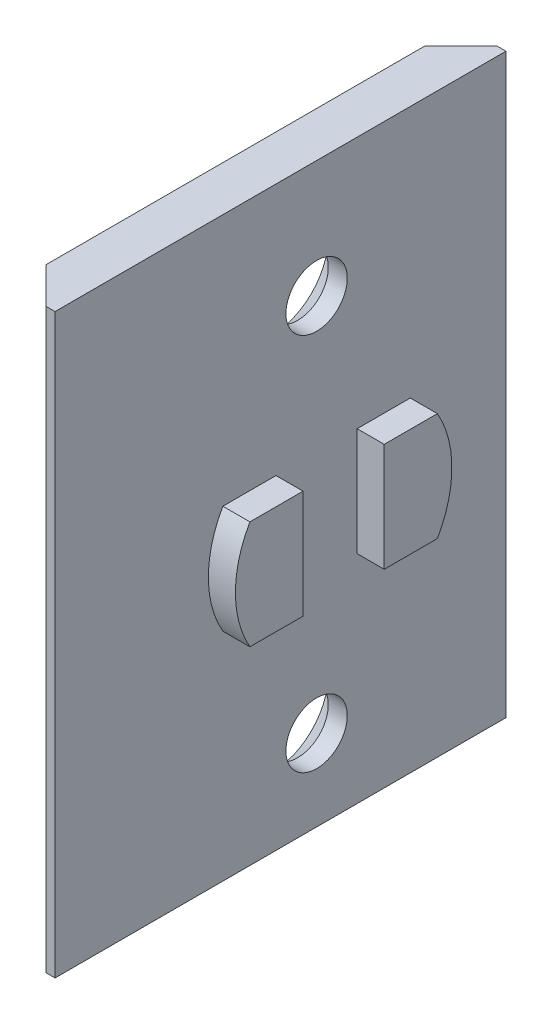
ISO-10303-21;
HEADER;
FILE_DESCRIPTION(('STEP AP214'),'2;1');
FILE_NAME('part.step','',(''),(''),'','','');
FILE_SCHEMA(('AUTOMOTIVE_DESIGN { 1 0 10303 214 1 1 1 1 }'));
ENDSEC;
DATA;
#1=APPLICATION_CONTEXT('core data for automotive mechanical design processes');
#2=APPLICATION_PROTOCOL_DEFINITION('international standard','automotive_design',2000,#1);
#3=PRODUCT_CONTEXT('',#1,'mechanical');
#4=PRODUCT('Part','Part','',(#3));
#5=PRODUCT_RELATED_PRODUCT_CATEGORY('part','',(#4));
#6=PRODUCT_DEFINITION_FORMATION('','',#4);
#7=PRODUCT_DEFINITION_CONTEXT('part definition',#1,'design');
#8=PRODUCT_DEFINITION('design','',#6,#7);
#9=PRODUCT_DEFINITION_SHAPE('','',#8);
#10=(LENGTH_UNIT() NAMED_UNIT(*) SI_UNIT(.MILLI.,.METRE.));
#11=(NAMED_UNIT(*) PLANE_ANGLE_UNIT() SI_UNIT($,.RADIAN.));
#12=(NAMED_UNIT(*) SI_UNIT($,.STERADIAN.) SOLID_ANGLE_UNIT());
#13=UNCERTAINTY_MEASURE_WITH_UNIT(LENGTH_MEASURE(1.E-05),#10,'distance_accuracy_value','');
#14=(GEOMETRIC_REPRESENTATION_CONTEXT(3) GLOBAL_UNCERTAINTY_ASSIGNED_CONTEXT((#13)) GLOBAL_UNIT_ASSIGNED_CONTEXT((#10,
#11,#12)) REPRESENTATION_CONTEXT('',''));
#15=CARTESIAN_POINT('',(0.,0.,0.));
#16=DIRECTION('',(0.,0.,1.));
#17=DIRECTION('',(1.,0.,0.));
#18=AXIS2_PLACEMENT_3D('',#15,#16,#17);
#19=CARTESIAN_POINT('',(4.,-1.00000000000006,-1.99999999999998));
#20=DIRECTION('',(-1.,0.,0.));
#21=DIRECTION('',(0.,0.,1.));
#22=AXIS2_PLACEMENT_3D('',#19,#20,#21);
#23=CYLINDRICAL_SURFACE('',#22,6.);
#24=DIRECTION('',(1.,0.,0.));
#25=VECTOR('',#24,1.);
#26=CARTESIAN_POINT('',(-8.316653826392,-4.00000000000005,3.19615242270664));
#27=LINE('',#26,#25);
#28=CARTESIAN_POINT('',(2.5,-4.00000000000007,3.19615242270668));
#29=VERTEX_POINT('',#28);
#30=CARTESIAN_POINT('',(3.99999999999999,-4.00000000000006,3.19615242270666));
#31=VERTEX_POINT('',#30);
#32=EDGE_CURVE('E149',#29,#31,#27,.T.);
#33=ORIENTED_EDGE('',*,*,#32,.T.);
#34=CARTESIAN_POINT('',(4.,-1.00000000000006,-1.99999999999998));
#35=DIRECTION('',(1.,0.,0.));
#36=DIRECTION('',(0.,0.,-1.));
#37=AXIS2_PLACEMENT_3D('',#34,#35,#36);
#38=CIRCLE('',#37,6.);
#39=CARTESIAN_POINT('',(4.,1.99999999999994,3.19615242270666));
#40=VERTEX_POINT('',#39);
#41=EDGE_CURVE('E224',#40,#31,#38,.T.);
#42=ORIENTED_EDGE('',*,*,#41,.F.);
#43=DIRECTION('',(1.,0.,0.));
#44=VECTOR('',#43,1.);
#45=CARTESIAN_POINT('',(-8.316653826392,1.99999999999995,3.19615242270664));
#46=LINE('',#45,#44);
#47=CARTESIAN_POINT('',(2.5,1.99999999999995,3.19615242270666));
#48=VERTEX_POINT('',#47);
#49=EDGE_CURVE('E243',#48,#40,#46,.T.);
#50=ORIENTED_EDGE('',*,*,#49,.F.);
#51=CARTESIAN_POINT('',(2.5,-1.00000000000006,-1.99999999999998));
#52=DIRECTION('',(-1.,0.,0.));
#53=DIRECTION('',(0.,0.,1.));
#54=AXIS2_PLACEMENT_3D('',#51,#52,#53);
#55=CIRCLE('',#54,6.);
#56=EDGE_CURVE('E156',#48,#29,#55,.F.);
#57=ORIENTED_EDGE('',*,*,#56,.T.);
#58=EDGE_LOOP('',(#33,#42,#50,#57));
#59=FACE_BOUND('',#58,.T.);
#60=ADVANCED_FACE('F36',(#59),#23,.T.);
#61=CARTESIAN_POINT('',(4.,0.,0.));
#62=DIRECTION('',(1.,0.,0.));
#63=DIRECTION('',(0.,0.,-1.));
#64=AXIS2_PLACEMENT_3D('',#61,#62,#63);
#65=PLANE('',#64);
#66=ORIENTED_EDGE('',*,*,#41,.T.);
#67=DIRECTION('',(0.,0.,-1.));
#68=VECTOR('',#67,1.);
#69=CARTESIAN_POINT('',(4.,-4.00000000000006,0.));
#70=LINE('',#69,#68);
#71=CARTESIAN_POINT('',(4.,-4.00000000000006,0.250000000000021));
#72=VERTEX_POINT('',#71);
#73=EDGE_CURVE('E253',#31,#72,#70,.T.);
#74=ORIENTED_EDGE('',*,*,#73,.T.);
#75=DIRECTION('',(0.,1.,0.));
#76=VECTOR('',#75,1.);
#77=CARTESIAN_POINT('',(4.,0.,0.250000000000021));
#78=LINE('',#77,#76);
#79=CARTESIAN_POINT('',(4.,1.99999999999994,0.250000000000021));
#80=VERTEX_POINT('',#79);
#81=EDGE_CURVE('E232',#72,#80,#78,.T.);
#82=ORIENTED_EDGE('',*,*,#81,.T.);
#83=DIRECTION('',(0.,0.,-1.));
#84=VECTOR('',#83,1.);
#85=CARTESIAN_POINT('',(4.,1.99999999999994,0.));
#86=LINE('',#85,#84);
#87=EDGE_CURVE('E245',#40,#80,#86,.T.);
#88=ORIENTED_EDGE('',*,*,#87,.F.);
#89=EDGE_LOOP('',(#66,#74,#82,#88));
#90=FACE_BOUND('',#89,.T.);
#91=ADVANCED_FACE('F260',(#90),#65,.T.);
#92=CARTESIAN_POINT('',(4.,0.,-4.24999999999999));
#93=DIRECTION('',(0.,0.,1.));
#94=DIRECTION('',(1.,0.,0.));
#95=AXIS2_PLACEMENT_3D('',#92,#93,#94);
#96=PLANE('',#95);
#97=DIRECTION('',(0.,1.,0.));
#98=VECTOR('',#97,1.);
#99=CARTESIAN_POINT('',(2.5,0.,-4.24999999999999));
#100=LINE('',#99,#98);
#101=CARTESIAN_POINT('',(2.5,-4.00000000000006,-4.24999999999999));
#102=VERTEX_POINT('',#101);
#103=CARTESIAN_POINT('',(2.5,1.99999999999995,-4.24999999999999));
#104=VERTEX_POINT('',#103);
#105=EDGE_CURVE('E228',#102,#104,#100,.T.);
#106=ORIENTED_EDGE('',*,*,#105,.F.);
#107=DIRECTION('',(1.,0.,0.));
#108=VECTOR('',#107,1.);
#109=CARTESIAN_POINT('',(4.,-4.00000000000006,-4.24999999999999));
#110=LINE('',#109,#108);
#111=CARTESIAN_POINT('',(4.,-4.00000000000006,-4.24999999999999));
#112=VERTEX_POINT('',#111);
#113=EDGE_CURVE('E137',#102,#112,#110,.T.);
#114=ORIENTED_EDGE('',*,*,#113,.T.);
#115=DIRECTION('',(0.,1.,0.));
#116=VECTOR('',#115,1.);
#117=CARTESIAN_POINT('',(4.,0.,-4.24999999999999));
#118=LINE('',#117,#116);
#119=CARTESIAN_POINT('',(4.,1.99999999999994,-4.24999999999999));
#120=VERTEX_POINT('',#119);
#121=EDGE_CURVE('E227',#112,#120,#118,.T.);
#122=ORIENTED_EDGE('',*,*,#121,.T.);
#123=DIRECTION('',(1.,0.,0.));
#124=VECTOR('',#123,1.);
#125=CARTESIAN_POINT('',(4.,1.99999999999994,-4.24999999999999));
#126=LINE('',#125,#124);
#127=EDGE_CURVE('E230',#104,#120,#126,.T.);
#128=ORIENTED_EDGE('',*,*,#127,.F.);
#129=EDGE_LOOP('',(#106,#114,#122,#128));
#130=FACE_BOUND('',#129,.T.);
#131=ADVANCED_FACE('F285',(#130),#96,.T.);
#132=CARTESIAN_POINT('',(4.,0.,0.250000000000021));
#133=DIRECTION('',(0.,0.,1.));
#134=DIRECTION('',(1.,0.,0.));
#135=AXIS2_PLACEMENT_3D('',#132,#133,#134);
#136=PLANE('',#135);
#137=DIRECTION('',(1.,0.,0.));
#138=VECTOR('',#137,1.);
#139=CARTESIAN_POINT('',(4.,-4.00000000000006,0.250000000000021));
#140=LINE('',#139,#138);
#141=CARTESIAN_POINT('',(2.5,-4.00000000000006,0.250000000000021));
#142=VERTEX_POINT('',#141);
#143=EDGE_CURVE('E251',#142,#72,#140,.T.);
#144=ORIENTED_EDGE('',*,*,#143,.F.);
#145=DIRECTION('',(0.,1.,0.));
#146=VECTOR('',#145,1.);
#147=CARTESIAN_POINT('',(2.5,0.,0.250000000000021));
#148=LINE('',#147,#146);
#149=CARTESIAN_POINT('',(2.5,1.99999999999995,0.250000000000021));
#150=VERTEX_POINT('',#149);
#151=EDGE_CURVE('E225',#142,#150,#148,.T.);
#152=ORIENTED_EDGE('',*,*,#151,.T.);
#153=DIRECTION('',(1.,0.,0.));
#154=VECTOR('',#153,1.);
#155=CARTESIAN_POINT('',(4.,1.99999999999994,0.250000000000021));
#156=LINE('',#155,#154);
#157=EDGE_CURVE('E237',#150,#80,#156,.T.);
#158=ORIENTED_EDGE('',*,*,#157,.T.);
#159=ORIENTED_EDGE('',*,*,#81,.F.);
#160=EDGE_LOOP('',(#144,#152,#158,#159));
#161=FACE_BOUND('',#160,.T.);
#162=ADVANCED_FACE('F264',(#161),#136,.F.);
#163=DIRECTION('',(1.,0.,0.));
#164=VECTOR('',#163,1.);
#165=CARTESIAN_POINT('',(-8.31665382639199,-4.00000000000005,-7.19615242270664));
#166=LINE('',#165,#164);
#167=CARTESIAN_POINT('',(2.5,-4.00000000000006,-7.19615242270662));
#168=VERTEX_POINT('',#167);
#169=CARTESIAN_POINT('',(4.,-4.00000000000006,-7.19615242270662));
#170=VERTEX_POINT('',#169);
#171=EDGE_CURVE('E59',#168,#170,#166,.T.);
#172=ORIENTED_EDGE('',*,*,#171,.F.);
#173=CARTESIAN_POINT('',(2.5,1.99999999999995,-7.19615242270665));
#174=VERTEX_POINT('',#173);
#175=EDGE_CURVE('E146',#168,#174,#55,.F.);
#176=ORIENTED_EDGE('',*,*,#175,.T.);
#177=DIRECTION('',(1.,0.,0.));
#178=VECTOR('',#177,1.);
#179=CARTESIAN_POINT('',(-8.31665382639198,1.99999999999995,-7.19615242270664));
#180=LINE('',#179,#178);
#181=CARTESIAN_POINT('',(4.00000000000001,1.99999999999994,-7.19615242270662));
#182=VERTEX_POINT('',#181);
#183=EDGE_CURVE('E240',#174,#182,#180,.T.);
#184=ORIENTED_EDGE('',*,*,#183,.T.);
#185=EDGE_CURVE('E148',#170,#182,#38,.T.);
#186=ORIENTED_EDGE('',*,*,#185,.F.);
#187=EDGE_LOOP('',(#172,#176,#184,#186));
#188=FACE_BOUND('',#187,.T.);
#189=ADVANCED_FACE('F144',(#188),#23,.T.);
#190=ORIENTED_EDGE('',*,*,#121,.F.);
#191=DIRECTION('',(0.,0.,-1.));
#192=VECTOR('',#191,1.);
#193=CARTESIAN_POINT('',(4.,-4.00000000000006,0.));
#194=LINE('',#193,#192);
#195=EDGE_CURVE('E11',#112,#170,#194,.T.);
#196=ORIENTED_EDGE('',*,*,#195,.T.);
#197=ORIENTED_EDGE('',*,*,#185,.T.);
#198=DIRECTION('',(0.,0.,-1.));
#199=VECTOR('',#198,1.);
#200=CARTESIAN_POINT('',(4.,1.99999999999994,0.));
#201=LINE('',#200,#199);
#202=EDGE_CURVE('E44',#120,#182,#201,.T.);
#203=ORIENTED_EDGE('',*,*,#202,.F.);
#204=EDGE_LOOP('',(#190,#196,#197,#203));
#205=FACE_BOUND('',#204,.T.);
#206=ADVANCED_FACE('F287',(#205),#65,.T.);
#207=CARTESIAN_POINT('',(2.5,-16.,-12.5));
#208=DIRECTION('',(0.,0.,1.));
#209=DIRECTION('',(1.,0.,0.));
#210=AXIS2_PLACEMENT_3D('',#207,#208,#209);
#211=PLANE('',#210);
#212=DIRECTION('',(-1.,0.,0.));
#213=VECTOR('',#212,1.);
#214=CARTESIAN_POINT('',(2.5,-16.,-12.5));
#215=LINE('',#214,#213);
#216=CARTESIAN_POINT('',(2.5,-16.,-12.5));
#217=VERTEX_POINT('',#216);
#218=CARTESIAN_POINT('',(2.,-16.,-12.5));
#219=VERTEX_POINT('',#218);
#220=EDGE_CURVE('E188',#217,#219,#215,.T.);
#221=ORIENTED_EDGE('',*,*,#220,.T.);
#222=DIRECTION('',(0.,1.,0.));
#223=VECTOR('',#222,1.);
#224=CARTESIAN_POINT('',(2.,16.,-12.5));
#225=LINE('',#224,#223);
#226=CARTESIAN_POINT('',(2.,16.,-12.5));
#227=VERTEX_POINT('',#226);
#228=EDGE_CURVE('E160',#219,#227,#225,.T.);
#229=ORIENTED_EDGE('',*,*,#228,.T.);
#230=DIRECTION('',(-1.,0.,0.));
#231=VECTOR('',#230,1.);
#232=CARTESIAN_POINT('',(2.5,16.,-12.5));
#233=LINE('',#232,#231);
#234=CARTESIAN_POINT('',(2.5,16.,-12.5));
#235=VERTEX_POINT('',#234);
#236=EDGE_CURVE('E179',#235,#227,#233,.T.);
#237=ORIENTED_EDGE('',*,*,#236,.F.);
#238=DIRECTION('',(0.,1.,0.));
#239=VECTOR('',#238,1.);
#240=CARTESIAN_POINT('',(2.5,-16.,-12.5));
#241=LINE('',#240,#239);
#242=EDGE_CURVE('E195',#217,#235,#241,.T.);
#243=ORIENTED_EDGE('',*,*,#242,.F.);
#244=EDGE_LOOP('',(#221,#229,#237,#243));
#245=FACE_BOUND('',#244,.T.);
#246=ADVANCED_FACE('F294',(#245),#211,.F.);
#247=CARTESIAN_POINT('',(2.5,16.,12.5));
#248=DIRECTION('',(0.,-1.,0.));
#249=DIRECTION('',(0.,0.,-1.));
#250=AXIS2_PLACEMENT_3D('',#247,#248,#249);
#251=PLANE('',#250);
#252=DIRECTION('',(0.,0.,1.));
#253=VECTOR('',#252,1.);
#254=CARTESIAN_POINT('',(0.,16.,12.5));
#255=LINE('',#254,#253);
#256=CARTESIAN_POINT('',(0.,16.,-10.5));
#257=VERTEX_POINT('',#256);
#258=CARTESIAN_POINT('',(0.,16.,10.5));
#259=VERTEX_POINT('',#258);
#260=EDGE_CURVE('E196',#257,#259,#255,.T.);
#261=ORIENTED_EDGE('',*,*,#260,.T.);
#262=DIRECTION('',(0.707106781186547,0.,0.707106781186548));
#263=VECTOR('',#262,1.);
#264=CARTESIAN_POINT('',(2.,16.,12.5));
#265=LINE('',#264,#263);
#266=CARTESIAN_POINT('',(2.,16.,12.5));
#267=VERTEX_POINT('',#266);
#268=EDGE_CURVE('E164',#259,#267,#265,.T.);
#269=ORIENTED_EDGE('',*,*,#268,.T.);
#270=DIRECTION('',(-1.,0.,0.));
#271=VECTOR('',#270,1.);
#272=CARTESIAN_POINT('',(2.5,16.,12.5));
#273=LINE('',#272,#271);
#274=CARTESIAN_POINT('',(2.5,16.,12.5));
#275=VERTEX_POINT('',#274);
#276=EDGE_CURVE('E182',#275,#267,#273,.T.);
#277=ORIENTED_EDGE('',*,*,#276,.F.);
#278=DIRECTION('',(0.,0.,1.));
#279=VECTOR('',#278,1.);
#280=CARTESIAN_POINT('',(2.5,16.,12.5));
#281=LINE('',#280,#279);
#282=EDGE_CURVE('E203',#235,#275,#281,.T.);
#283=ORIENTED_EDGE('',*,*,#282,.F.);
#284=ORIENTED_EDGE('',*,*,#236,.T.);
#285=DIRECTION('',(-0.707106781186547,0.,0.707106781186548));
#286=VECTOR('',#285,1.);
#287=CARTESIAN_POINT('',(2.,16.,-12.5));
#288=LINE('',#287,#286);
#289=EDGE_CURVE('E166',#227,#257,#288,.T.);
#290=ORIENTED_EDGE('',*,*,#289,.T.);
#291=EDGE_LOOP('',(#261,#269,#277,#283,#284,#290));
#292=FACE_BOUND('',#291,.T.);
#293=ADVANCED_FACE('F333',(#292),#251,.F.);
#294=CARTESIAN_POINT('',(2.5,-16.,12.5));
#295=DIRECTION('',(0.,0.,-1.));
#296=DIRECTION('',(-1.,0.,0.));
#297=AXIS2_PLACEMENT_3D('',#294,#295,#296);
#298=PLANE('',#297);
#299=ORIENTED_EDGE('',*,*,#276,.T.);
#300=DIRECTION('',(0.,-1.,0.));
#301=VECTOR('',#300,1.);
#302=CARTESIAN_POINT('',(2.,-16.,12.5));
#303=LINE('',#302,#301);
#304=CARTESIAN_POINT('',(2.,-16.,12.5));
#305=VERTEX_POINT('',#304);
#306=EDGE_CURVE('E176',#267,#305,#303,.T.);
#307=ORIENTED_EDGE('',*,*,#306,.T.);
#308=DIRECTION('',(-1.,0.,0.));
#309=VECTOR('',#308,1.);
#310=CARTESIAN_POINT('',(2.5,-16.,12.5));
#311=LINE('',#310,#309);
#312=CARTESIAN_POINT('',(2.5,-16.,12.5));
#313=VERTEX_POINT('',#312);
#314=EDGE_CURVE('E185',#313,#305,#311,.T.);
#315=ORIENTED_EDGE('',*,*,#314,.F.);
#316=DIRECTION('',(0.,-1.,0.));
#317=VECTOR('',#316,1.);
#318=CARTESIAN_POINT('',(2.5,-16.,12.5));
#319=LINE('',#318,#317);
#320=EDGE_CURVE('E201',#275,#313,#319,.T.);
#321=ORIENTED_EDGE('',*,*,#320,.F.);
#322=EDGE_LOOP('',(#299,#307,#315,#321));
#323=FACE_BOUND('',#322,.T.);
#324=ADVANCED_FACE('F329',(#323),#298,.F.);
#325=CARTESIAN_POINT('',(2.5,-16.,12.5));
#326=DIRECTION('',(0.,1.,0.));
#327=DIRECTION('',(0.,0.,1.));
#328=AXIS2_PLACEMENT_3D('',#325,#326,#327);
#329=PLANE('',#328);
#330=ORIENTED_EDGE('',*,*,#314,.T.);
#331=DIRECTION('',(-0.707106781186547,0.,-0.707106781186548));
#332=VECTOR('',#331,1.);
#333=CARTESIAN_POINT('',(2.,-16.,12.5));
#334=LINE('',#333,#332);
#335=CARTESIAN_POINT('',(0.,-16.,10.5));
#336=VERTEX_POINT('',#335);
#337=EDGE_CURVE('E172',#305,#336,#334,.T.);
#338=ORIENTED_EDGE('',*,*,#337,.T.);
#339=DIRECTION('',(0.,0.,-1.));
#340=VECTOR('',#339,1.);
#341=CARTESIAN_POINT('',(0.,-16.,12.5));
#342=LINE('',#341,#340);
#343=CARTESIAN_POINT('',(0.,-16.,-10.5));
#344=VERTEX_POINT('',#343);
#345=EDGE_CURVE('E192',#336,#344,#342,.T.);
#346=ORIENTED_EDGE('',*,*,#345,.T.);
#347=DIRECTION('',(0.707106781186547,0.,-0.707106781186548));
#348=VECTOR('',#347,1.);
#349=CARTESIAN_POINT('',(2.,-16.,-12.5));
#350=LINE('',#349,#348);
#351=EDGE_CURVE('E174',#344,#219,#350,.T.);
#352=ORIENTED_EDGE('',*,*,#351,.T.);
#353=ORIENTED_EDGE('',*,*,#220,.F.);
#354=DIRECTION('',(0.,0.,-1.));
#355=VECTOR('',#354,1.);
#356=CARTESIAN_POINT('',(2.5,-16.,12.5));
#357=LINE('',#356,#355);
#358=EDGE_CURVE('E191',#313,#217,#357,.T.);
#359=ORIENTED_EDGE('',*,*,#358,.F.);
#360=EDGE_LOOP('',(#330,#338,#346,#352,#353,#359));
#361=FACE_BOUND('',#360,.T.);
#362=ADVANCED_FACE('F322',(#361),#329,.F.);
#363=CARTESIAN_POINT('',(2.5,0.,0.));
#364=DIRECTION('',(-1.,0.,0.));
#365=DIRECTION('',(0.,0.,1.));
#366=AXIS2_PLACEMENT_3D('',#363,#364,#365);
#367=PLANE('',#366);
#368=ORIENTED_EDGE('',*,*,#151,.F.);
#369=DIRECTION('',(0.,0.,-1.));
#370=VECTOR('',#369,1.);
#371=CARTESIAN_POINT('',(2.5,-4.00000000000006,0.));
#372=LINE('',#371,#370);
#373=EDGE_CURVE('E51',#29,#142,#372,.T.);
#374=ORIENTED_EDGE('',*,*,#373,.F.);
#375=ORIENTED_EDGE('',*,*,#56,.F.);
#376=DIRECTION('',(0.,0.,-1.));
#377=VECTOR('',#376,1.);
#378=CARTESIAN_POINT('',(2.5,1.99999999999995,0.));
#379=LINE('',#378,#377);
#380=EDGE_CURVE('E242',#48,#150,#379,.T.);
#381=ORIENTED_EDGE('',*,*,#380,.T.);
#382=EDGE_LOOP('',(#368,#374,#375,#381));
#383=FACE_BOUND('',#382,.T.);
#384=ORIENTED_EDGE('',*,*,#175,.F.);
#385=EDGE_CURVE('E134',#102,#168,#372,.T.);
#386=ORIENTED_EDGE('',*,*,#385,.F.);
#387=ORIENTED_EDGE('',*,*,#105,.T.);
#388=EDGE_CURVE('E154',#104,#174,#379,.T.);
#389=ORIENTED_EDGE('',*,*,#388,.T.);
#390=EDGE_LOOP('',(#384,#386,#387,#389));
#391=FACE_BOUND('',#390,.T.);
#392=CARTESIAN_POINT('',(2.5,-11.5000000000001,-1.99999999999998));
#393=DIRECTION('',(-1.,0.,0.));
#394=DIRECTION('',(0.,0.,1.));
#395=AXIS2_PLACEMENT_3D('',#392,#393,#394);
#396=CIRCLE('',#395,1.7);
#397=CARTESIAN_POINT('',(2.5,-11.5000000000001,-0.299999999999984));
#398=VERTEX_POINT('',#397);
#399=EDGE_CURVE('E215',#398,#398,#396,.T.);
#400=ORIENTED_EDGE('',*,*,#399,.T.);
#401=EDGE_LOOP('',(#400));
#402=FACE_BOUND('',#401,.T.);
#403=CARTESIAN_POINT('',(2.5,9.49999999999995,-1.99999999999998));
#404=DIRECTION('',(-1.,0.,0.));
#405=DIRECTION('',(0.,0.,1.));
#406=AXIS2_PLACEMENT_3D('',#403,#404,#405);
#407=CIRCLE('',#406,1.7);
#408=CARTESIAN_POINT('',(2.5,9.49999999999995,-0.299999999999986));
#409=VERTEX_POINT('',#408);
#410=EDGE_CURVE('E199',#409,#409,#407,.T.);
#411=ORIENTED_EDGE('',*,*,#410,.T.);
#412=EDGE_LOOP('',(#411));
#413=FACE_BOUND('',#412,.T.);
#414=ORIENTED_EDGE('',*,*,#242,.T.);
#415=ORIENTED_EDGE('',*,*,#282,.T.);
#416=ORIENTED_EDGE('',*,*,#320,.T.);
#417=ORIENTED_EDGE('',*,*,#358,.T.);
#418=EDGE_LOOP('',(#414,#415,#416,#417));
#419=FACE_BOUND('',#418,.T.);
#420=ADVANCED_FACE('F151',(#383,#391,#402,#413,#419),#367,.F.);
#421=CARTESIAN_POINT('',(0.,0.,0.));
#422=DIRECTION('',(-1.,0.,0.));
#423=DIRECTION('',(0.,0.,1.));
#424=AXIS2_PLACEMENT_3D('',#421,#422,#423);
#425=PLANE('',#424);
#426=CARTESIAN_POINT('',(0.,-11.5000000000001,-1.99999999999998));
#427=DIRECTION('',(-1.,0.,0.));
#428=DIRECTION('',(0.,0.,1.));
#429=AXIS2_PLACEMENT_3D('',#426,#427,#428);
#430=CIRCLE('',#429,3.15);
#431=CARTESIAN_POINT('',(0.,-11.5000000000001,1.15000000000002));
#432=VERTEX_POINT('',#431);
#433=EDGE_CURVE('E221',#432,#432,#430,.T.);
#434=ORIENTED_EDGE('',*,*,#433,.F.);
#435=EDGE_LOOP('',(#434));
#436=FACE_BOUND('',#435,.T.);
#437=CARTESIAN_POINT('',(0.,9.49999999999995,-1.99999999999998));
#438=DIRECTION('',(-1.,0.,0.));
#439=DIRECTION('',(0.,0.,1.));
#440=AXIS2_PLACEMENT_3D('',#437,#438,#439);
#441=CIRCLE('',#440,3.15);
#442=CARTESIAN_POINT('',(0.,9.49999999999995,1.15000000000002));
#443=VERTEX_POINT('',#442);
#444=EDGE_CURVE('E212',#443,#443,#441,.T.);
#445=ORIENTED_EDGE('',*,*,#444,.F.);
#446=EDGE_LOOP('',(#445));
#447=FACE_BOUND('',#446,.T.);
#448=ORIENTED_EDGE('',*,*,#345,.F.);
#449=DIRECTION('',(0.,1.,0.));
#450=VECTOR('',#449,1.);
#451=CARTESIAN_POINT('',(0.,16.,10.5));
#452=LINE('',#451,#450);
#453=EDGE_CURVE('E168',#336,#259,#452,.T.);
#454=ORIENTED_EDGE('',*,*,#453,.T.);
#455=ORIENTED_EDGE('',*,*,#260,.F.);
#456=DIRECTION('',(0.,-1.,0.));
#457=VECTOR('',#456,1.);
#458=CARTESIAN_POINT('',(0.,-16.,-10.5));
#459=LINE('',#458,#457);
#460=EDGE_CURVE('E170',#257,#344,#459,.T.);
#461=ORIENTED_EDGE('',*,*,#460,.T.);
#462=EDGE_LOOP('',(#448,#454,#455,#461));
#463=FACE_BOUND('',#462,.T.);
#464=ADVANCED_FACE('F321',(#436,#447,#463),#425,.T.);
#465=CARTESIAN_POINT('',(2.,-16.,12.5));
#466=DIRECTION('',(-0.707106781186548,0.,0.707106781186547));
#467=DIRECTION('',(0.,1.,0.));
#468=AXIS2_PLACEMENT_3D('',#465,#466,#467);
#469=PLANE('',#468);
#470=ORIENTED_EDGE('',*,*,#268,.F.);
#471=ORIENTED_EDGE('',*,*,#453,.F.);
#472=ORIENTED_EDGE('',*,*,#337,.F.);
#473=ORIENTED_EDGE('',*,*,#306,.F.);
#474=EDGE_LOOP('',(#470,#471,#472,#473));
#475=FACE_BOUND('',#474,.T.);
#476=ADVANCED_FACE('F325',(#475),#469,.T.);
#477=CARTESIAN_POINT('',(2.,-16.,-12.5));
#478=DIRECTION('',(-0.707106781186548,0.,-0.707106781186547));
#479=DIRECTION('',(0.,-1.,0.));
#480=AXIS2_PLACEMENT_3D('',#477,#478,#479);
#481=PLANE('',#480);
#482=ORIENTED_EDGE('',*,*,#351,.F.);
#483=ORIENTED_EDGE('',*,*,#460,.F.);
#484=ORIENTED_EDGE('',*,*,#289,.F.);
#485=ORIENTED_EDGE('',*,*,#228,.F.);
#486=EDGE_LOOP('',(#482,#483,#484,#485));
#487=FACE_BOUND('',#486,.T.);
#488=ADVANCED_FACE('F38',(#487),#481,.T.);
#489=CARTESIAN_POINT('',(0.,9.49999999999995,-1.99999999999998));
#490=DIRECTION('',(-1.,0.,0.));
#491=DIRECTION('',(0.,0.,1.));
#492=AXIS2_PLACEMENT_3D('',#489,#490,#491);
#493=CYLINDRICAL_SURFACE('',#492,1.7);
#494=ORIENTED_EDGE('',*,*,#410,.F.);
#495=EDGE_LOOP('',(#494));
#496=FACE_BOUND('',#495,.T.);
#497=CARTESIAN_POINT('',(1.45,9.49999999999995,-1.99999999999998));
#498=DIRECTION('',(-1.,0.,0.));
#499=DIRECTION('',(0.,0.,1.));
#500=AXIS2_PLACEMENT_3D('',#497,#498,#499);
#501=CIRCLE('',#500,1.7);
#502=CARTESIAN_POINT('',(1.45,9.49999999999995,-0.299999999999986));
#503=VERTEX_POINT('',#502);
#504=EDGE_CURVE('E209',#503,#503,#501,.T.);
#505=ORIENTED_EDGE('',*,*,#504,.T.);
#506=EDGE_LOOP('',(#505));
#507=FACE_BOUND('',#506,.T.);
#508=ADVANCED_FACE('F314',(#496,#507),#493,.F.);
#509=CARTESIAN_POINT('',(0.,9.49999999999995,-1.99999999999998));
#510=DIRECTION('',(-1.,0.,0.));
#511=DIRECTION('',(0.,0.,1.));
#512=AXIS2_PLACEMENT_3D('',#509,#510,#511);
#513=CONICAL_SURFACE('',#512,3.15,0.785398163397448);
#514=ORIENTED_EDGE('',*,*,#504,.F.);
#515=EDGE_LOOP('',(#514));
#516=FACE_BOUND('',#515,.T.);
#517=ORIENTED_EDGE('',*,*,#444,.T.);
#518=EDGE_LOOP('',(#517));
#519=FACE_BOUND('',#518,.T.);
#520=ADVANCED_FACE('F310',(#516,#519),#513,.F.);
#521=CARTESIAN_POINT('',(0.,-11.5000000000001,-1.99999999999998));
#522=DIRECTION('',(-1.,0.,0.));
#523=DIRECTION('',(0.,0.,1.));
#524=AXIS2_PLACEMENT_3D('',#521,#522,#523);
#525=CYLINDRICAL_SURFACE('',#524,1.7);
#526=ORIENTED_EDGE('',*,*,#399,.F.);
#527=EDGE_LOOP('',(#526));
#528=FACE_BOUND('',#527,.T.);
#529=CARTESIAN_POINT('',(1.45,-11.5000000000001,-1.99999999999998));
#530=DIRECTION('',(-1.,0.,0.));
#531=DIRECTION('',(0.,0.,1.));
#532=AXIS2_PLACEMENT_3D('',#529,#530,#531);
#533=CIRCLE('',#532,1.7);
#534=CARTESIAN_POINT('',(1.45,-11.5000000000001,-0.299999999999984));
#535=VERTEX_POINT('',#534);
#536=EDGE_CURVE('E218',#535,#535,#533,.T.);
#537=ORIENTED_EDGE('',*,*,#536,.T.);
#538=EDGE_LOOP('',(#537));
#539=FACE_BOUND('',#538,.T.);
#540=ADVANCED_FACE('F306',(#528,#539),#525,.F.);
#541=CARTESIAN_POINT('',(0.,-11.5000000000001,-1.99999999999998));
#542=DIRECTION('',(-1.,0.,0.));
#543=DIRECTION('',(0.,0.,1.));
#544=AXIS2_PLACEMENT_3D('',#541,#542,#543);
#545=CONICAL_SURFACE('',#544,3.15,0.785398163397448);
#546=ORIENTED_EDGE('',*,*,#536,.F.);
#547=EDGE_LOOP('',(#546));
#548=FACE_BOUND('',#547,.T.);
#549=ORIENTED_EDGE('',*,*,#433,.T.);
#550=EDGE_LOOP('',(#549));
#551=FACE_BOUND('',#550,.T.);
#552=ADVANCED_FACE('F302',(#548,#551),#545,.F.);
#553=CARTESIAN_POINT('',(-8.316653826392,1.99999999999995,0.));
#554=DIRECTION('',(0.,-1.,0.));
#555=DIRECTION('',(1.,0.,0.));
#556=AXIS2_PLACEMENT_3D('',#553,#554,#555);
#557=PLANE('',#556);
#558=ORIENTED_EDGE('',*,*,#127,.T.);
#559=ORIENTED_EDGE('',*,*,#202,.T.);
#560=ORIENTED_EDGE('',*,*,#183,.F.);
#561=ORIENTED_EDGE('',*,*,#388,.F.);
#562=EDGE_LOOP('',(#558,#559,#560,#561));
#563=FACE_BOUND('',#562,.T.);
#564=ADVANCED_FACE('F305',(#563),#557,.F.);
#565=ORIENTED_EDGE('',*,*,#380,.F.);
#566=ORIENTED_EDGE('',*,*,#49,.T.);
#567=ORIENTED_EDGE('',*,*,#87,.T.);
#568=ORIENTED_EDGE('',*,*,#157,.F.);
#569=EDGE_LOOP('',(#565,#566,#567,#568));
#570=FACE_BOUND('',#569,.T.);
#571=ADVANCED_FACE('F268',(#570),#557,.F.);
#572=CARTESIAN_POINT('',(-8.316653826392,-4.00000000000005,0.));
#573=DIRECTION('',(0.,-1.,0.));
#574=DIRECTION('',(1.,0.,0.));
#575=AXIS2_PLACEMENT_3D('',#572,#573,#574);
#576=PLANE('',#575);
#577=ORIENTED_EDGE('',*,*,#385,.T.);
#578=ORIENTED_EDGE('',*,*,#171,.T.);
#579=ORIENTED_EDGE('',*,*,#195,.F.);
#580=ORIENTED_EDGE('',*,*,#113,.F.);
#581=EDGE_LOOP('',(#577,#578,#579,#580));
#582=FACE_BOUND('',#581,.T.);
#583=ADVANCED_FACE('F135',(#582),#576,.T.);
#584=ORIENTED_EDGE('',*,*,#143,.T.);
#585=ORIENTED_EDGE('',*,*,#73,.F.);
#586=ORIENTED_EDGE('',*,*,#32,.F.);
#587=ORIENTED_EDGE('',*,*,#373,.T.);
#588=EDGE_LOOP('',(#584,#585,#586,#587));
#589=FACE_BOUND('',#588,.T.);
#590=ADVANCED_FACE('F273',(#589),#576,.T.);
#591=CLOSED_SHELL('',(#60,#91,#131,#162,#189,#206,#246,#293,#324,#362,#420,#464,#476,#488,#508,
#520,#540,#552,#564,#571,#583,#590));
#592=MANIFOLD_SOLID_BREP('B2',#591);
#593=ADVANCED_BREP_SHAPE_REPRESENTATION('',(#18,#592),#14);
#594=SHAPE_DEFINITION_REPRESENTATION(#9,#593);
ENDSEC;
END-ISO-10303-21;
